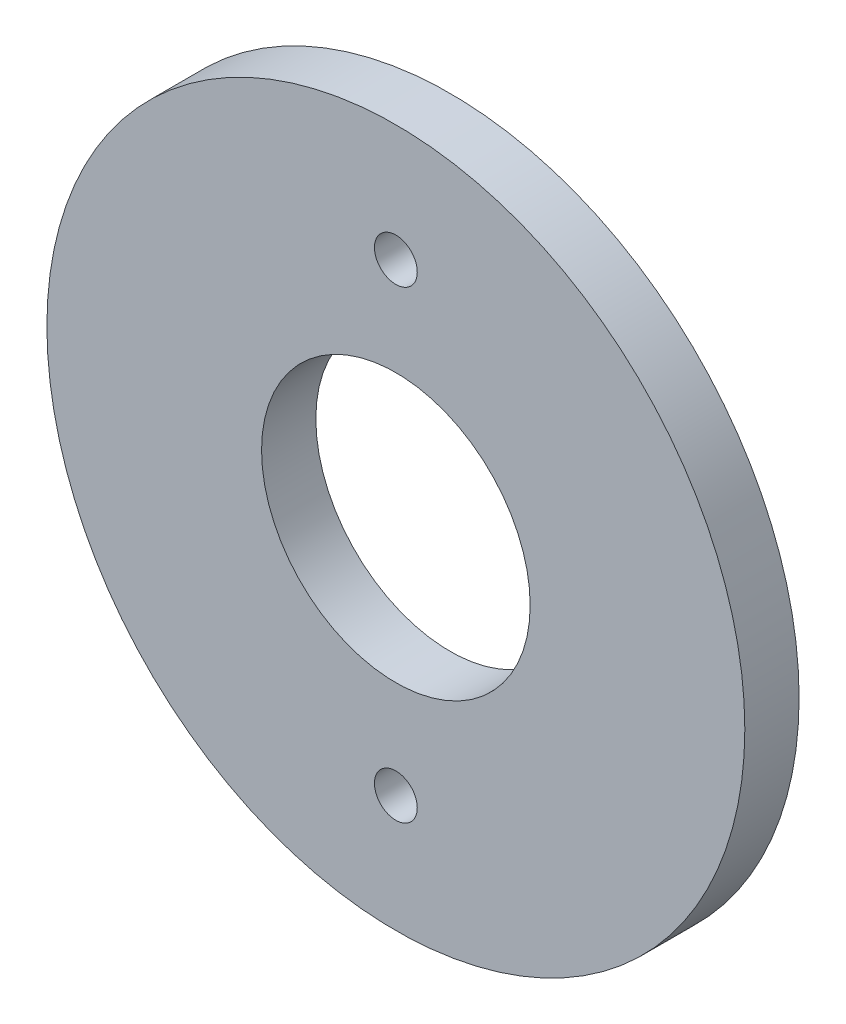
ISO-10303-21;
HEADER;
FILE_DESCRIPTION(('STEP AP214'),'2;1');
FILE_NAME('part.step','',(''),(''),'','','');
FILE_SCHEMA(('AUTOMOTIVE_DESIGN { 1 0 10303 214 1 1 1 1 }'));
ENDSEC;
DATA;
#1=APPLICATION_CONTEXT('core data for automotive mechanical design processes');
#2=APPLICATION_PROTOCOL_DEFINITION('international standard','automotive_design',2000,#1);
#3=PRODUCT_CONTEXT('',#1,'mechanical');
#4=PRODUCT('Part','Part','',(#3));
#5=PRODUCT_RELATED_PRODUCT_CATEGORY('part','',(#4));
#6=PRODUCT_DEFINITION_FORMATION('','',#4);
#7=PRODUCT_DEFINITION_CONTEXT('part definition',#1,'design');
#8=PRODUCT_DEFINITION('design','',#6,#7);
#9=PRODUCT_DEFINITION_SHAPE('','',#8);
#10=(LENGTH_UNIT() NAMED_UNIT(*) SI_UNIT(.MILLI.,.METRE.));
#11=(NAMED_UNIT(*) PLANE_ANGLE_UNIT() SI_UNIT($,.RADIAN.));
#12=(NAMED_UNIT(*) SI_UNIT($,.STERADIAN.) SOLID_ANGLE_UNIT());
#13=UNCERTAINTY_MEASURE_WITH_UNIT(LENGTH_MEASURE(1.E-05),#10,'distance_accuracy_value','');
#14=(GEOMETRIC_REPRESENTATION_CONTEXT(3) GLOBAL_UNCERTAINTY_ASSIGNED_CONTEXT((#13)) GLOBAL_UNIT_ASSIGNED_CONTEXT((#10,
#11,#12)) REPRESENTATION_CONTEXT('',''));
#15=CARTESIAN_POINT('',(0.,0.,0.));
#16=DIRECTION('',(0.,0.,1.));
#17=DIRECTION('',(1.,0.,0.));
#18=AXIS2_PLACEMENT_3D('',#15,#16,#17);
#19=CARTESIAN_POINT('',(0.,0.,4.445));
#20=DIRECTION('',(0.,0.,1.));
#21=DIRECTION('',(1.,0.,0.));
#22=AXIS2_PLACEMENT_3D('',#19,#20,#21);
#23=PLANE('',#22);
#24=CARTESIAN_POINT('',(0.,18.9992,4.445));
#25=DIRECTION('',(0.,0.,1.));
#26=DIRECTION('',(1.,0.,0.));
#27=AXIS2_PLACEMENT_3D('',#24,#25,#26);
#28=CIRCLE('',#27,1.7526);
#29=CARTESIAN_POINT('',(1.7526,18.9992,4.445));
#30=VERTEX_POINT('',#29);
#31=EDGE_CURVE('E49',#30,#30,#28,.T.);
#32=ORIENTED_EDGE('',*,*,#31,.F.);
#33=EDGE_LOOP('',(#32));
#34=FACE_BOUND('',#33,.T.);
#35=CARTESIAN_POINT('',(0.,0.,4.445));
#36=DIRECTION('',(0.,0.,1.));
#37=DIRECTION('',(1.,0.,0.));
#38=AXIS2_PLACEMENT_3D('',#35,#36,#37);
#39=CIRCLE('',#38,28.575);
#40=CARTESIAN_POINT('',(28.575,0.,4.445));
#41=VERTEX_POINT('',#40);
#42=EDGE_CURVE('E10',#41,#41,#39,.T.);
#43=ORIENTED_EDGE('',*,*,#42,.T.);
#44=EDGE_LOOP('',(#43));
#45=FACE_BOUND('',#44,.T.);
#46=CARTESIAN_POINT('',(0.,0.,4.445));
#47=DIRECTION('',(0.,0.,1.));
#48=DIRECTION('',(1.,0.,0.));
#49=AXIS2_PLACEMENT_3D('',#46,#47,#48);
#50=CIRCLE('',#49,10.9982);
#51=CARTESIAN_POINT('',(10.9982,0.,4.445));
#52=VERTEX_POINT('',#51);
#53=EDGE_CURVE('E44',#52,#52,#50,.T.);
#54=ORIENTED_EDGE('',*,*,#53,.F.);
#55=EDGE_LOOP('',(#54));
#56=FACE_BOUND('',#55,.T.);
#57=CARTESIAN_POINT('',(0.,-18.9992,4.445));
#58=DIRECTION('',(0.,0.,1.));
#59=DIRECTION('',(1.,0.,0.));
#60=AXIS2_PLACEMENT_3D('',#57,#58,#59);
#61=CIRCLE('',#60,1.7526);
#62=CARTESIAN_POINT('',(1.7526,-18.9992,4.445));
#63=VERTEX_POINT('',#62);
#64=EDGE_CURVE('E55',#63,#63,#61,.T.);
#65=ORIENTED_EDGE('',*,*,#64,.F.);
#66=EDGE_LOOP('',(#65));
#67=FACE_BOUND('',#66,.T.);
#68=ADVANCED_FACE('F33',(#34,#45,#56,#67),#23,.T.);
#69=CARTESIAN_POINT('',(0.,0.,0.));
#70=DIRECTION('',(0.,0.,1.));
#71=DIRECTION('',(1.,0.,0.));
#72=AXIS2_PLACEMENT_3D('',#69,#70,#71);
#73=PLANE('',#72);
#74=CARTESIAN_POINT('',(0.,18.9992,0.));
#75=DIRECTION('',(0.,0.,1.));
#76=DIRECTION('',(1.,0.,0.));
#77=AXIS2_PLACEMENT_3D('',#74,#75,#76);
#78=CIRCLE('',#77,1.7526);
#79=CARTESIAN_POINT('',(1.7526,18.9992,0.));
#80=VERTEX_POINT('',#79);
#81=EDGE_CURVE('E52',#80,#80,#78,.T.);
#82=ORIENTED_EDGE('',*,*,#81,.T.);
#83=EDGE_LOOP('',(#82));
#84=FACE_BOUND('',#83,.T.);
#85=CARTESIAN_POINT('',(0.,0.,0.));
#86=DIRECTION('',(0.,0.,1.));
#87=DIRECTION('',(1.,0.,0.));
#88=AXIS2_PLACEMENT_3D('',#85,#86,#87);
#89=CIRCLE('',#88,28.575);
#90=CARTESIAN_POINT('',(28.575,0.,0.));
#91=VERTEX_POINT('',#90);
#92=EDGE_CURVE('E37',#91,#91,#89,.T.);
#93=ORIENTED_EDGE('',*,*,#92,.F.);
#94=EDGE_LOOP('',(#93));
#95=FACE_BOUND('',#94,.T.);
#96=CARTESIAN_POINT('',(0.,0.,0.));
#97=DIRECTION('',(0.,0.,1.));
#98=DIRECTION('',(1.,0.,0.));
#99=AXIS2_PLACEMENT_3D('',#96,#97,#98);
#100=CIRCLE('',#99,10.9982);
#101=CARTESIAN_POINT('',(10.9982,0.,0.));
#102=VERTEX_POINT('',#101);
#103=EDGE_CURVE('E46',#102,#102,#100,.T.);
#104=ORIENTED_EDGE('',*,*,#103,.T.);
#105=EDGE_LOOP('',(#104));
#106=FACE_BOUND('',#105,.T.);
#107=CARTESIAN_POINT('',(0.,-18.9992,0.));
#108=DIRECTION('',(0.,0.,1.));
#109=DIRECTION('',(1.,0.,0.));
#110=AXIS2_PLACEMENT_3D('',#107,#108,#109);
#111=CIRCLE('',#110,1.7526);
#112=CARTESIAN_POINT('',(1.7526,-18.9992,0.));
#113=VERTEX_POINT('',#112);
#114=EDGE_CURVE('E58',#113,#113,#111,.T.);
#115=ORIENTED_EDGE('',*,*,#114,.T.);
#116=EDGE_LOOP('',(#115));
#117=FACE_BOUND('',#116,.T.);
#118=ADVANCED_FACE('F68',(#84,#95,#106,#117),#73,.F.);
#119=CARTESIAN_POINT('',(0.,0.,4.445));
#120=DIRECTION('',(0.,0.,-1.));
#121=DIRECTION('',(-1.,0.,0.));
#122=AXIS2_PLACEMENT_3D('',#119,#120,#121);
#123=CYLINDRICAL_SURFACE('',#122,28.575);
#124=ORIENTED_EDGE('',*,*,#42,.F.);
#125=EDGE_LOOP('',(#124));
#126=FACE_BOUND('',#125,.T.);
#127=ORIENTED_EDGE('',*,*,#92,.T.);
#128=EDGE_LOOP('',(#127));
#129=FACE_BOUND('',#128,.T.);
#130=ADVANCED_FACE('F35',(#126,#129),#123,.T.);
#131=CARTESIAN_POINT('',(0.,0.,4.445));
#132=DIRECTION('',(0.,0.,-1.));
#133=DIRECTION('',(-1.,0.,0.));
#134=AXIS2_PLACEMENT_3D('',#131,#132,#133);
#135=CYLINDRICAL_SURFACE('',#134,10.9982);
#136=ORIENTED_EDGE('',*,*,#53,.T.);
#137=EDGE_LOOP('',(#136));
#138=FACE_BOUND('',#137,.T.);
#139=ORIENTED_EDGE('',*,*,#103,.F.);
#140=EDGE_LOOP('',(#139));
#141=FACE_BOUND('',#140,.T.);
#142=ADVANCED_FACE('F77',(#138,#141),#135,.F.);
#143=CARTESIAN_POINT('',(0.,18.9992,4.445));
#144=DIRECTION('',(0.,0.,-1.));
#145=DIRECTION('',(-1.,0.,0.));
#146=AXIS2_PLACEMENT_3D('',#143,#144,#145);
#147=CYLINDRICAL_SURFACE('',#146,1.7526);
#148=ORIENTED_EDGE('',*,*,#31,.T.);
#149=EDGE_LOOP('',(#148));
#150=FACE_BOUND('',#149,.T.);
#151=ORIENTED_EDGE('',*,*,#81,.F.);
#152=EDGE_LOOP('',(#151));
#153=FACE_BOUND('',#152,.T.);
#154=ADVANCED_FACE('F80',(#150,#153),#147,.F.);
#155=CARTESIAN_POINT('',(0.,-18.9992,4.445));
#156=DIRECTION('',(0.,0.,-1.));
#157=DIRECTION('',(-1.,0.,0.));
#158=AXIS2_PLACEMENT_3D('',#155,#156,#157);
#159=CYLINDRICAL_SURFACE('',#158,1.7526);
#160=ORIENTED_EDGE('',*,*,#64,.T.);
#161=EDGE_LOOP('',(#160));
#162=FACE_BOUND('',#161,.T.);
#163=ORIENTED_EDGE('',*,*,#114,.F.);
#164=EDGE_LOOP('',(#163));
#165=FACE_BOUND('',#164,.T.);
#166=ADVANCED_FACE('F64',(#162,#165),#159,.F.);
#167=CLOSED_SHELL('',(#68,#118,#130,#142,#154,#166));
#168=MANIFOLD_SOLID_BREP('B2',#167);
#169=ADVANCED_BREP_SHAPE_REPRESENTATION('',(#18,#168),#14);
#170=SHAPE_DEFINITION_REPRESENTATION(#9,#169);
ENDSEC;
END-ISO-10303-21;
